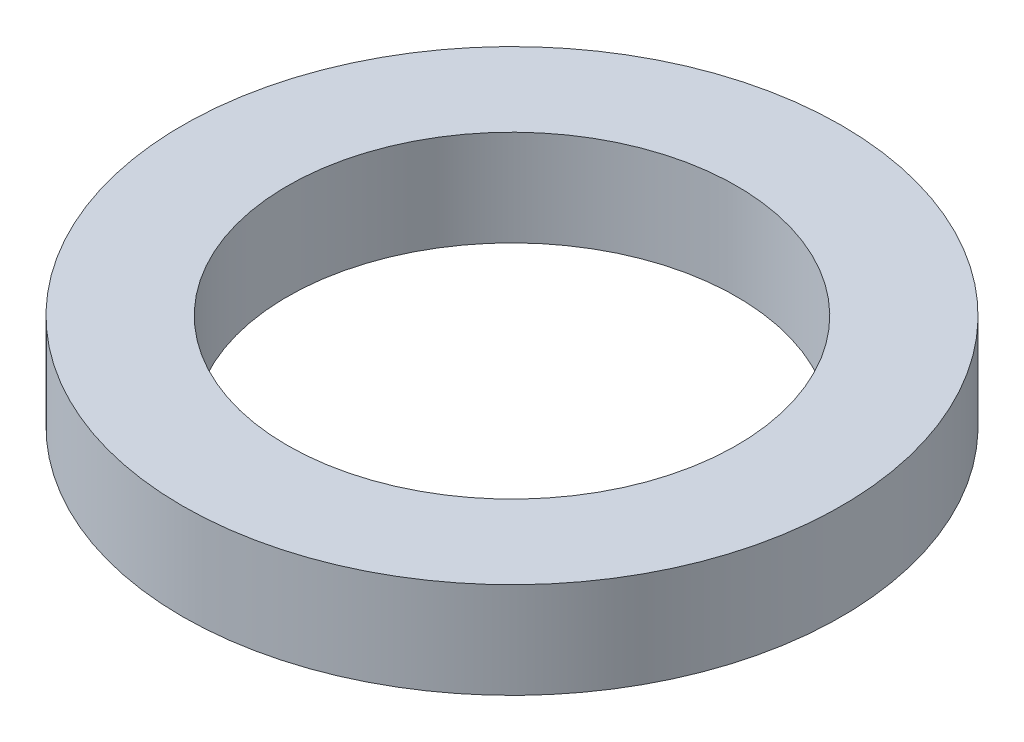
ISO-10303-21;
HEADER;
FILE_DESCRIPTION(('STEP AP214'),'2;1');
FILE_NAME('part.step','',(''),(''),'','','');
FILE_SCHEMA(('AUTOMOTIVE_DESIGN { 1 0 10303 214 1 1 1 1 }'));
ENDSEC;
DATA;
#1=APPLICATION_CONTEXT('core data for automotive mechanical design processes');
#2=APPLICATION_PROTOCOL_DEFINITION('international standard','automotive_design',2000,#1);
#3=PRODUCT_CONTEXT('',#1,'mechanical');
#4=PRODUCT('Part','Part','',(#3));
#5=PRODUCT_RELATED_PRODUCT_CATEGORY('part','',(#4));
#6=PRODUCT_DEFINITION_FORMATION('','',#4);
#7=PRODUCT_DEFINITION_CONTEXT('part definition',#1,'design');
#8=PRODUCT_DEFINITION('design','',#6,#7);
#9=PRODUCT_DEFINITION_SHAPE('','',#8);
#10=(LENGTH_UNIT() NAMED_UNIT(*) SI_UNIT(.MILLI.,.METRE.));
#11=(NAMED_UNIT(*) PLANE_ANGLE_UNIT() SI_UNIT($,.RADIAN.));
#12=(NAMED_UNIT(*) SI_UNIT($,.STERADIAN.) SOLID_ANGLE_UNIT());
#13=UNCERTAINTY_MEASURE_WITH_UNIT(LENGTH_MEASURE(1.E-05),#10,'distance_accuracy_value','');
#14=(GEOMETRIC_REPRESENTATION_CONTEXT(3) GLOBAL_UNCERTAINTY_ASSIGNED_CONTEXT((#13)) GLOBAL_UNIT_ASSIGNED_CONTEXT((#10,
#11,#12)) REPRESENTATION_CONTEXT('',''));
#15=CARTESIAN_POINT('',(0.,0.,0.));
#16=DIRECTION('',(0.,0.,1.));
#17=DIRECTION('',(1.,0.,0.));
#18=AXIS2_PLACEMENT_3D('',#15,#16,#17);
#19=CARTESIAN_POINT('',(0.,16.,0.));
#20=DIRECTION('',(0.,1.,0.));
#21=DIRECTION('',(0.,0.,1.));
#22=AXIS2_PLACEMENT_3D('',#19,#20,#21);
#23=PLANE('',#22);
#24=CARTESIAN_POINT('',(0.,16.,0.));
#25=DIRECTION('',(0.,1.,0.));
#26=DIRECTION('',(0.,0.,1.));
#27=AXIS2_PLACEMENT_3D('',#24,#25,#26);
#28=CIRCLE('',#27,55.);
#29=CARTESIAN_POINT('',(0.,16.,55.));
#30=VERTEX_POINT('',#29);
#31=EDGE_CURVE('E10',#30,#30,#28,.T.);
#32=ORIENTED_EDGE('',*,*,#31,.T.);
#33=EDGE_LOOP('',(#32));
#34=FACE_BOUND('',#33,.T.);
#35=CARTESIAN_POINT('',(0.,16.,0.));
#36=DIRECTION('',(0.,1.,0.));
#37=DIRECTION('',(0.,0.,1.));
#38=AXIS2_PLACEMENT_3D('',#35,#36,#37);
#39=CIRCLE('',#38,37.5);
#40=CARTESIAN_POINT('',(0.,16.,37.5));
#41=VERTEX_POINT('',#40);
#42=EDGE_CURVE('E42',#41,#41,#39,.T.);
#43=ORIENTED_EDGE('',*,*,#42,.F.);
#44=EDGE_LOOP('',(#43));
#45=FACE_BOUND('',#44,.T.);
#46=ADVANCED_FACE('F31',(#34,#45),#23,.T.);
#47=CARTESIAN_POINT('',(0.,0.,0.));
#48=DIRECTION('',(0.,1.,0.));
#49=DIRECTION('',(0.,0.,1.));
#50=AXIS2_PLACEMENT_3D('',#47,#48,#49);
#51=PLANE('',#50);
#52=CARTESIAN_POINT('',(0.,0.,0.));
#53=DIRECTION('',(0.,1.,0.));
#54=DIRECTION('',(0.,0.,1.));
#55=AXIS2_PLACEMENT_3D('',#52,#53,#54);
#56=CIRCLE('',#55,55.);
#57=CARTESIAN_POINT('',(0.,0.,55.));
#58=VERTEX_POINT('',#57);
#59=EDGE_CURVE('E35',#58,#58,#56,.T.);
#60=ORIENTED_EDGE('',*,*,#59,.F.);
#61=EDGE_LOOP('',(#60));
#62=FACE_BOUND('',#61,.T.);
#63=CARTESIAN_POINT('',(0.,0.,0.));
#64=DIRECTION('',(0.,1.,0.));
#65=DIRECTION('',(0.,0.,1.));
#66=AXIS2_PLACEMENT_3D('',#63,#64,#65);
#67=CIRCLE('',#66,37.5);
#68=CARTESIAN_POINT('',(0.,0.,37.5));
#69=VERTEX_POINT('',#68);
#70=EDGE_CURVE('E44',#69,#69,#67,.T.);
#71=ORIENTED_EDGE('',*,*,#70,.T.);
#72=EDGE_LOOP('',(#71));
#73=FACE_BOUND('',#72,.T.);
#74=ADVANCED_FACE('F54',(#62,#73),#51,.F.);
#75=CARTESIAN_POINT('',(0.,16.,0.));
#76=DIRECTION('',(0.,-1.,0.));
#77=DIRECTION('',(0.,0.,-1.));
#78=AXIS2_PLACEMENT_3D('',#75,#76,#77);
#79=CYLINDRICAL_SURFACE('',#78,55.);
#80=ORIENTED_EDGE('',*,*,#31,.F.);
#81=EDGE_LOOP('',(#80));
#82=FACE_BOUND('',#81,.T.);
#83=ORIENTED_EDGE('',*,*,#59,.T.);
#84=EDGE_LOOP('',(#83));
#85=FACE_BOUND('',#84,.T.);
#86=ADVANCED_FACE('F33',(#82,#85),#79,.T.);
#87=CARTESIAN_POINT('',(0.,16.,0.));
#88=DIRECTION('',(0.,-1.,0.));
#89=DIRECTION('',(0.,0.,-1.));
#90=AXIS2_PLACEMENT_3D('',#87,#88,#89);
#91=CYLINDRICAL_SURFACE('',#90,37.5);
#92=ORIENTED_EDGE('',*,*,#42,.T.);
#93=EDGE_LOOP('',(#92));
#94=FACE_BOUND('',#93,.T.);
#95=ORIENTED_EDGE('',*,*,#70,.F.);
#96=EDGE_LOOP('',(#95));
#97=FACE_BOUND('',#96,.T.);
#98=ADVANCED_FACE('F50',(#94,#97),#91,.F.);
#99=CLOSED_SHELL('',(#46,#74,#86,#98));
#100=MANIFOLD_SOLID_BREP('B2',#99);
#101=ADVANCED_BREP_SHAPE_REPRESENTATION('',(#18,#100),#14);
#102=SHAPE_DEFINITION_REPRESENTATION(#9,#101);
ENDSEC;
END-ISO-10303-21;
